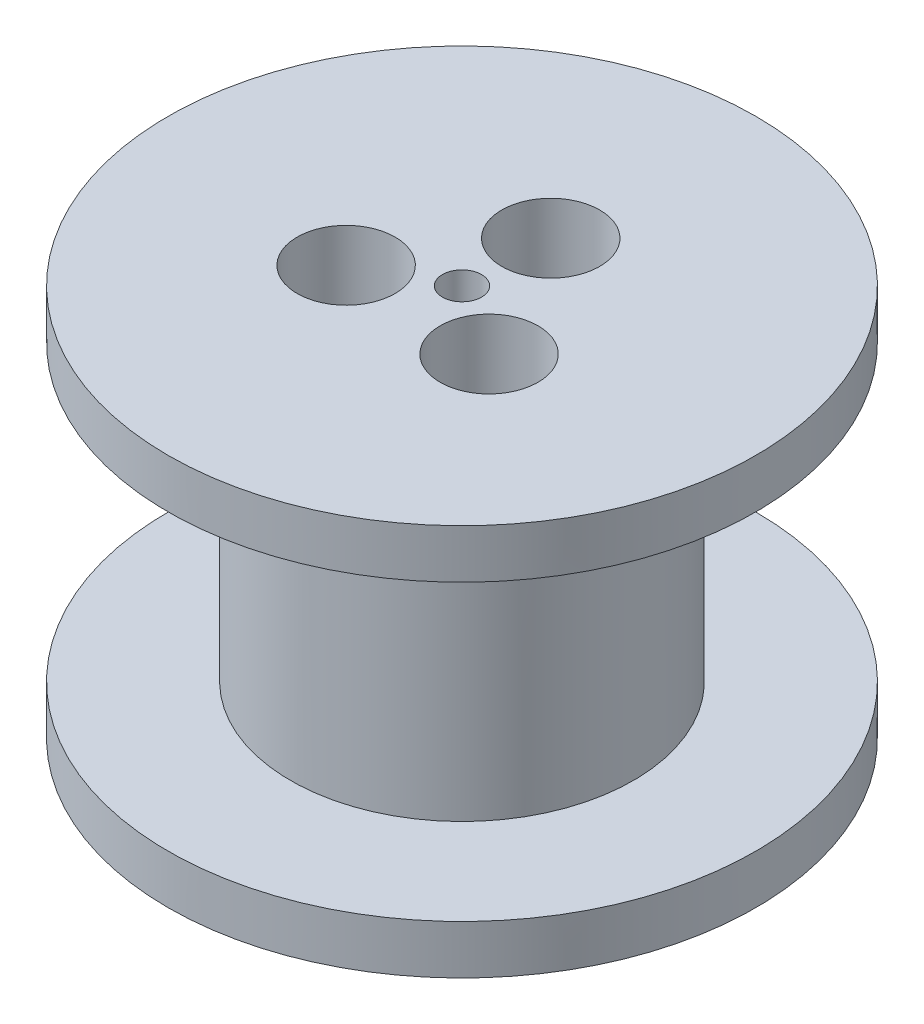
ISO-10303-21;
HEADER;
FILE_DESCRIPTION(('STEP AP214'),'2;1');
FILE_NAME('part.step','',(''),(''),'','','');
FILE_SCHEMA(('AUTOMOTIVE_DESIGN { 1 0 10303 214 1 1 1 1 }'));
ENDSEC;
DATA;
#1=APPLICATION_CONTEXT('core data for automotive mechanical design processes');
#2=APPLICATION_PROTOCOL_DEFINITION('international standard','automotive_design',2000,#1);
#3=PRODUCT_CONTEXT('',#1,'mechanical');
#4=PRODUCT('Part','Part','',(#3));
#5=PRODUCT_RELATED_PRODUCT_CATEGORY('part','',(#4));
#6=PRODUCT_DEFINITION_FORMATION('','',#4);
#7=PRODUCT_DEFINITION_CONTEXT('part definition',#1,'design');
#8=PRODUCT_DEFINITION('design','',#6,#7);
#9=PRODUCT_DEFINITION_SHAPE('','',#8);
#10=(LENGTH_UNIT() NAMED_UNIT(*) SI_UNIT(.MILLI.,.METRE.));
#11=(NAMED_UNIT(*) PLANE_ANGLE_UNIT() SI_UNIT($,.RADIAN.));
#12=(NAMED_UNIT(*) SI_UNIT($,.STERADIAN.) SOLID_ANGLE_UNIT());
#13=UNCERTAINTY_MEASURE_WITH_UNIT(LENGTH_MEASURE(1.E-05),#10,'distance_accuracy_value','');
#14=(GEOMETRIC_REPRESENTATION_CONTEXT(3) GLOBAL_UNCERTAINTY_ASSIGNED_CONTEXT((#13)) GLOBAL_UNIT_ASSIGNED_CONTEXT((#10,
#11,#12)) REPRESENTATION_CONTEXT('',''));
#15=CARTESIAN_POINT('',(0.,0.,0.));
#16=DIRECTION('',(0.,0.,1.));
#17=DIRECTION('',(1.,0.,0.));
#18=AXIS2_PLACEMENT_3D('',#15,#16,#17);
#19=CARTESIAN_POINT('',(0.,40.,0.));
#20=DIRECTION('',(0.,-1.,0.));
#21=DIRECTION('',(0.,0.,-1.));
#22=AXIS2_PLACEMENT_3D('',#19,#20,#21);
#23=CYLINDRICAL_SURFACE('',#22,30.);
#24=CARTESIAN_POINT('',(0.,40.,0.));
#25=DIRECTION('',(0.,1.,0.));
#26=DIRECTION('',(0.,0.,1.));
#27=AXIS2_PLACEMENT_3D('',#24,#25,#26);
#28=CIRCLE('',#27,30.);
#29=CARTESIAN_POINT('',(0.,40.,30.));
#30=VERTEX_POINT('',#29);
#31=EDGE_CURVE('E12',#30,#30,#28,.T.);
#32=ORIENTED_EDGE('',*,*,#31,.F.);
#33=EDGE_LOOP('',(#32));
#34=FACE_BOUND('',#33,.T.);
#35=CARTESIAN_POINT('',(0.,35.,0.));
#36=DIRECTION('',(0.,-1.,0.));
#37=DIRECTION('',(0.,0.,-1.));
#38=AXIS2_PLACEMENT_3D('',#35,#36,#37);
#39=CIRCLE('',#38,30.);
#40=CARTESIAN_POINT('',(0.,35.,-30.));
#41=VERTEX_POINT('',#40);
#42=EDGE_CURVE('E39',#41,#41,#39,.T.);
#43=ORIENTED_EDGE('',*,*,#42,.F.);
#44=EDGE_LOOP('',(#43));
#45=FACE_BOUND('',#44,.T.);
#46=ADVANCED_FACE('F35',(#34,#45),#23,.T.);
#47=CARTESIAN_POINT('',(0.,40.,0.));
#48=DIRECTION('',(0.,1.,0.));
#49=DIRECTION('',(0.,0.,1.));
#50=AXIS2_PLACEMENT_3D('',#47,#48,#49);
#51=PLANE('',#50);
#52=CARTESIAN_POINT('',(0.317902701636574,40.,-8.74422311427903));
#53=DIRECTION('',(0.,-1.,0.));
#54=DIRECTION('',(0.,0.,-1.));
#55=AXIS2_PLACEMENT_3D('',#52,#53,#54);
#56=CIRCLE('',#55,5.);
#57=CARTESIAN_POINT('',(0.317902701636574,40.,-13.744223114279));
#58=VERTEX_POINT('',#57);
#59=EDGE_CURVE('E217',#58,#58,#56,.T.);
#60=ORIENTED_EDGE('',*,*,#59,.T.);
#61=EDGE_LOOP('',(#60));
#62=FACE_BOUND('',#61,.T.);
#63=CARTESIAN_POINT('',(7.41376800250643,40.,4.64742337268849));
#64=DIRECTION('',(0.,-1.,0.));
#65=DIRECTION('',(0.,0.,-1.));
#66=AXIS2_PLACEMENT_3D('',#63,#64,#65);
#67=CIRCLE('',#66,5.);
#68=CARTESIAN_POINT('',(7.41376800250643,40.,-0.352576627311507));
#69=VERTEX_POINT('',#68);
#70=EDGE_CURVE('E221',#69,#69,#67,.T.);
#71=ORIENTED_EDGE('',*,*,#70,.T.);
#72=EDGE_LOOP('',(#71));
#73=FACE_BOUND('',#72,.T.);
#74=CARTESIAN_POINT('',(-7.73167070414301,40.,4.09679974159054));
#75=DIRECTION('',(0.,-1.,0.));
#76=DIRECTION('',(0.,0.,-1.));
#77=AXIS2_PLACEMENT_3D('',#74,#75,#76);
#78=CIRCLE('',#77,5.);
#79=CARTESIAN_POINT('',(-7.73167070414301,40.,-0.903200258409464));
#80=VERTEX_POINT('',#79);
#81=EDGE_CURVE('E231',#80,#80,#78,.T.);
#82=ORIENTED_EDGE('',*,*,#81,.T.);
#83=EDGE_LOOP('',(#82));
#84=FACE_BOUND('',#83,.T.);
#85=CARTESIAN_POINT('',(0.,40.,0.));
#86=DIRECTION('',(0.,-1.,0.));
#87=DIRECTION('',(0.,0.,-1.));
#88=AXIS2_PLACEMENT_3D('',#85,#86,#87);
#89=CIRCLE('',#88,2.);
#90=CARTESIAN_POINT('',(0.,40.,-2.));
#91=VERTEX_POINT('',#90);
#92=EDGE_CURVE('E73',#91,#91,#89,.T.);
#93=ORIENTED_EDGE('',*,*,#92,.T.);
#94=EDGE_LOOP('',(#93));
#95=FACE_BOUND('',#94,.T.);
#96=ORIENTED_EDGE('',*,*,#31,.T.);
#97=EDGE_LOOP('',(#96));
#98=FACE_BOUND('',#97,.T.);
#99=ADVANCED_FACE('F93',(#62,#73,#84,#95,#98),#51,.T.);
#100=CARTESIAN_POINT('',(0.,35.,0.));
#101=DIRECTION('',(0.,-1.,0.));
#102=DIRECTION('',(0.,0.,-1.));
#103=AXIS2_PLACEMENT_3D('',#100,#101,#102);
#104=PLANE('',#103);
#105=CARTESIAN_POINT('',(0.,35.,0.));
#106=DIRECTION('',(0.,-1.,0.));
#107=DIRECTION('',(0.,0.,-1.));
#108=AXIS2_PLACEMENT_3D('',#105,#106,#107);
#109=CIRCLE('',#108,17.5);
#110=CARTESIAN_POINT('',(0.,35.,-17.5));
#111=VERTEX_POINT('',#110);
#112=EDGE_CURVE('E62',#111,#111,#109,.T.);
#113=ORIENTED_EDGE('',*,*,#112,.F.);
#114=EDGE_LOOP('',(#113));
#115=FACE_BOUND('',#114,.T.);
#116=ORIENTED_EDGE('',*,*,#42,.T.);
#117=EDGE_LOOP('',(#116));
#118=FACE_BOUND('',#117,.T.);
#119=ADVANCED_FACE('F90',(#115,#118),#104,.T.);
#120=CARTESIAN_POINT('',(0.,5.,0.));
#121=DIRECTION('',(0.,-1.,0.));
#122=DIRECTION('',(0.,0.,-1.));
#123=AXIS2_PLACEMENT_3D('',#120,#121,#122);
#124=PLANE('',#123);
#125=CARTESIAN_POINT('',(0.,5.,0.));
#126=DIRECTION('',(0.,-1.,0.));
#127=DIRECTION('',(0.,0.,-1.));
#128=AXIS2_PLACEMENT_3D('',#125,#126,#127);
#129=CIRCLE('',#128,17.5);
#130=CARTESIAN_POINT('',(-14.2785338407005,5.,-10.1179776319169));
#131=VERTEX_POINT('',#130);
#132=CARTESIAN_POINT('',(-16.2005846637719,5.,-6.61748113347961));
#133=VERTEX_POINT('',#132);
#134=EDGE_CURVE('E63',#131,#133,#129,.T.);
#135=ORIENTED_EDGE('',*,*,#134,.T.);
#136=CARTESIAN_POINT('',(-15.3397371273536,5.,-8.42273499901836));
#137=DIRECTION('',(0.,1.,0.));
#138=DIRECTION('',(0.,0.,1.));
#139=AXIS2_PLACEMENT_3D('',#136,#137,#138);
#140=CIRCLE('',#139,2.);
#141=EDGE_CURVE('E51',#131,#133,#140,.T.);
#142=ORIENTED_EDGE('',*,*,#141,.F.);
#143=EDGE_LOOP('',(#135,#142));
#144=FACE_BOUND('',#143,.T.);
#145=CARTESIAN_POINT('',(0.,5.,0.));
#146=DIRECTION('',(0.,-1.,0.));
#147=DIRECTION('',(0.,0.,-1.));
#148=AXIS2_PLACEMENT_3D('',#145,#146,#147);
#149=CIRCLE('',#148,30.);
#150=CARTESIAN_POINT('',(0.,5.,-30.));
#151=VERTEX_POINT('',#150);
#152=EDGE_CURVE('E81',#151,#151,#149,.T.);
#153=ORIENTED_EDGE('',*,*,#152,.F.);
#154=EDGE_LOOP('',(#153));
#155=FACE_BOUND('',#154,.T.);
#156=ADVANCED_FACE('F69',(#144,#155),#124,.F.);
#157=CARTESIAN_POINT('',(0.,35.,0.));
#158=DIRECTION('',(0.,-1.,0.));
#159=DIRECTION('',(0.,0.,-1.));
#160=AXIS2_PLACEMENT_3D('',#157,#158,#159);
#161=CYLINDRICAL_SURFACE('',#160,17.5);
#162=ORIENTED_EDGE('',*,*,#112,.T.);
#163=EDGE_LOOP('',(#162));
#164=FACE_BOUND('',#163,.T.);
#165=EDGE_CURVE('E56',#133,#131,#129,.T.);
#166=ORIENTED_EDGE('',*,*,#165,.F.);
#167=ORIENTED_EDGE('',*,*,#134,.F.);
#168=EDGE_LOOP('',(#166,#167));
#169=FACE_BOUND('',#168,.T.);
#170=ADVANCED_FACE('F72',(#164,#169),#161,.T.);
#171=CARTESIAN_POINT('',(0.,0.,0.));
#172=DIRECTION('',(0.,1.,0.));
#173=DIRECTION('',(0.,0.,1.));
#174=AXIS2_PLACEMENT_3D('',#171,#172,#173);
#175=PLANE('',#174);
#176=CARTESIAN_POINT('',(-15.3397371273536,0.,-8.42273499901836));
#177=DIRECTION('',(0.,1.,0.));
#178=DIRECTION('',(0.,0.,1.));
#179=AXIS2_PLACEMENT_3D('',#176,#177,#178);
#180=CIRCLE('',#179,2.);
#181=CARTESIAN_POINT('',(-15.3397371273536,0.,-6.42273499901836));
#182=VERTEX_POINT('',#181);
#183=EDGE_CURVE('E71',#182,#182,#180,.F.);
#184=ORIENTED_EDGE('',*,*,#183,.F.);
#185=EDGE_LOOP('',(#184));
#186=FACE_BOUND('',#185,.T.);
#187=CARTESIAN_POINT('',(0.317902701636574,0.,-8.74422311427903));
#188=DIRECTION('',(0.,-1.,0.));
#189=DIRECTION('',(0.,0.,-1.));
#190=AXIS2_PLACEMENT_3D('',#187,#188,#189);
#191=CIRCLE('',#190,5.);
#192=CARTESIAN_POINT('',(0.317902701636574,0.,-13.744223114279));
#193=VERTEX_POINT('',#192);
#194=EDGE_CURVE('E220',#193,#193,#191,.T.);
#195=ORIENTED_EDGE('',*,*,#194,.F.);
#196=EDGE_LOOP('',(#195));
#197=FACE_BOUND('',#196,.T.);
#198=CARTESIAN_POINT('',(7.41376800250643,0.,4.64742337268849));
#199=DIRECTION('',(0.,-1.,0.));
#200=DIRECTION('',(0.,0.,-1.));
#201=AXIS2_PLACEMENT_3D('',#198,#199,#200);
#202=CIRCLE('',#201,5.);
#203=CARTESIAN_POINT('',(7.41376800250643,0.,-0.352576627311507));
#204=VERTEX_POINT('',#203);
#205=EDGE_CURVE('E225',#204,#204,#202,.T.);
#206=ORIENTED_EDGE('',*,*,#205,.F.);
#207=EDGE_LOOP('',(#206));
#208=FACE_BOUND('',#207,.T.);
#209=CARTESIAN_POINT('',(-7.73167070414301,0.,4.09679974159054));
#210=DIRECTION('',(0.,-1.,0.));
#211=DIRECTION('',(0.,0.,-1.));
#212=AXIS2_PLACEMENT_3D('',#209,#210,#211);
#213=CIRCLE('',#212,5.);
#214=CARTESIAN_POINT('',(-7.73167070414301,0.,-0.903200258409464));
#215=VERTEX_POINT('',#214);
#216=EDGE_CURVE('E234',#215,#215,#213,.T.);
#217=ORIENTED_EDGE('',*,*,#216,.F.);
#218=EDGE_LOOP('',(#217));
#219=FACE_BOUND('',#218,.T.);
#220=CARTESIAN_POINT('',(0.,0.,0.));
#221=DIRECTION('',(0.,-1.,0.));
#222=DIRECTION('',(0.,0.,-1.));
#223=AXIS2_PLACEMENT_3D('',#220,#221,#222);
#224=CIRCLE('',#223,2.);
#225=CARTESIAN_POINT('',(0.,0.,-2.));
#226=VERTEX_POINT('',#225);
#227=EDGE_CURVE('E75',#226,#226,#224,.T.);
#228=ORIENTED_EDGE('',*,*,#227,.F.);
#229=EDGE_LOOP('',(#228));
#230=FACE_BOUND('',#229,.T.);
#231=CARTESIAN_POINT('',(0.,0.,0.));
#232=DIRECTION('',(0.,1.,0.));
#233=DIRECTION('',(0.,0.,1.));
#234=AXIS2_PLACEMENT_3D('',#231,#232,#233);
#235=CIRCLE('',#234,30.);
#236=CARTESIAN_POINT('',(0.,0.,30.));
#237=VERTEX_POINT('',#236);
#238=EDGE_CURVE('E44',#237,#237,#235,.T.);
#239=ORIENTED_EDGE('',*,*,#238,.F.);
#240=EDGE_LOOP('',(#239));
#241=FACE_BOUND('',#240,.T.);
#242=ADVANCED_FACE('F107',(#186,#197,#208,#219,#230,#241),#175,.F.);
#243=ORIENTED_EDGE('',*,*,#152,.T.);
#244=EDGE_LOOP('',(#243));
#245=FACE_BOUND('',#244,.T.);
#246=ORIENTED_EDGE('',*,*,#238,.T.);
#247=EDGE_LOOP('',(#246));
#248=FACE_BOUND('',#247,.T.);
#249=ADVANCED_FACE('F37',(#245,#248),#23,.T.);
#250=CARTESIAN_POINT('',(0.,40.,0.));
#251=DIRECTION('',(0.,-1.,0.));
#252=DIRECTION('',(0.,0.,-1.));
#253=AXIS2_PLACEMENT_3D('',#250,#251,#252);
#254=CYLINDRICAL_SURFACE('',#253,2.);
#255=ORIENTED_EDGE('',*,*,#92,.F.);
#256=EDGE_LOOP('',(#255));
#257=FACE_BOUND('',#256,.T.);
#258=ORIENTED_EDGE('',*,*,#227,.T.);
#259=EDGE_LOOP('',(#258));
#260=FACE_BOUND('',#259,.T.);
#261=ADVANCED_FACE('F106',(#257,#260),#254,.F.);
#262=CARTESIAN_POINT('',(-7.73167070414301,40.,4.09679974159054));
#263=DIRECTION('',(0.,-1.,0.));
#264=DIRECTION('',(0.,0.,-1.));
#265=AXIS2_PLACEMENT_3D('',#262,#263,#264);
#266=CYLINDRICAL_SURFACE('',#265,5.);
#267=ORIENTED_EDGE('',*,*,#81,.F.);
#268=EDGE_LOOP('',(#267));
#269=FACE_BOUND('',#268,.T.);
#270=ORIENTED_EDGE('',*,*,#216,.T.);
#271=EDGE_LOOP('',(#270));
#272=FACE_BOUND('',#271,.T.);
#273=ADVANCED_FACE('F112',(#269,#272),#266,.F.);
#274=CARTESIAN_POINT('',(7.41376800250643,40.,4.64742337268849));
#275=DIRECTION('',(0.,-1.,0.));
#276=DIRECTION('',(0.,0.,-1.));
#277=AXIS2_PLACEMENT_3D('',#274,#275,#276);
#278=CYLINDRICAL_SURFACE('',#277,5.);
#279=ORIENTED_EDGE('',*,*,#70,.F.);
#280=EDGE_LOOP('',(#279));
#281=FACE_BOUND('',#280,.T.);
#282=ORIENTED_EDGE('',*,*,#205,.T.);
#283=EDGE_LOOP('',(#282));
#284=FACE_BOUND('',#283,.T.);
#285=ADVANCED_FACE('F130',(#281,#284),#278,.F.);
#286=CARTESIAN_POINT('',(0.317902701636574,40.,-8.74422311427903));
#287=DIRECTION('',(0.,-1.,0.));
#288=DIRECTION('',(0.,0.,-1.));
#289=AXIS2_PLACEMENT_3D('',#286,#287,#288);
#290=CYLINDRICAL_SURFACE('',#289,5.);
#291=ORIENTED_EDGE('',*,*,#59,.F.);
#292=EDGE_LOOP('',(#291));
#293=FACE_BOUND('',#292,.T.);
#294=ORIENTED_EDGE('',*,*,#194,.T.);
#295=EDGE_LOOP('',(#294));
#296=FACE_BOUND('',#295,.T.);
#297=ADVANCED_FACE('F134',(#293,#296),#290,.F.);
#298=CARTESIAN_POINT('',(-15.3397371273536,-0.00100000000000013,-8.42273499901836));
#299=DIRECTION('',(0.,1.,0.));
#300=DIRECTION('',(0.,0.,1.));
#301=AXIS2_PLACEMENT_3D('',#298,#299,#300);
#302=CYLINDRICAL_SURFACE('',#301,2.);
#303=ORIENTED_EDGE('',*,*,#141,.T.);
#304=EDGE_CURVE('E58',#133,#131,#140,.T.);
#305=ORIENTED_EDGE('',*,*,#304,.T.);
#306=EDGE_LOOP('',(#303,#305));
#307=FACE_BOUND('',#306,.T.);
#308=ORIENTED_EDGE('',*,*,#183,.T.);
#309=EDGE_LOOP('',(#308));
#310=FACE_BOUND('',#309,.T.);
#311=ADVANCED_FACE('F65',(#307,#310),#302,.F.);
#312=CARTESIAN_POINT('',(-15.3397371273536,5.,-8.42273499901836));
#313=DIRECTION('',(0.,1.,0.));
#314=DIRECTION('',(0.,0.,1.));
#315=AXIS2_PLACEMENT_3D('',#312,#313,#314);
#316=PLANE('',#315);
#317=ORIENTED_EDGE('',*,*,#165,.T.);
#318=ORIENTED_EDGE('',*,*,#304,.F.);
#319=EDGE_LOOP('',(#317,#318));
#320=FACE_BOUND('',#319,.T.);
#321=ADVANCED_FACE('F57',(#320),#316,.F.);
#322=CLOSED_SHELL('',(#46,#99,#119,#156,#170,#242,#249,#261,#273,#285,#297,#311,#321));
#323=MANIFOLD_SOLID_BREP('B2',#322);
#324=ADVANCED_BREP_SHAPE_REPRESENTATION('',(#18,#323),#14);
#325=SHAPE_DEFINITION_REPRESENTATION(#9,#324);
ENDSEC;
END-ISO-10303-21;
